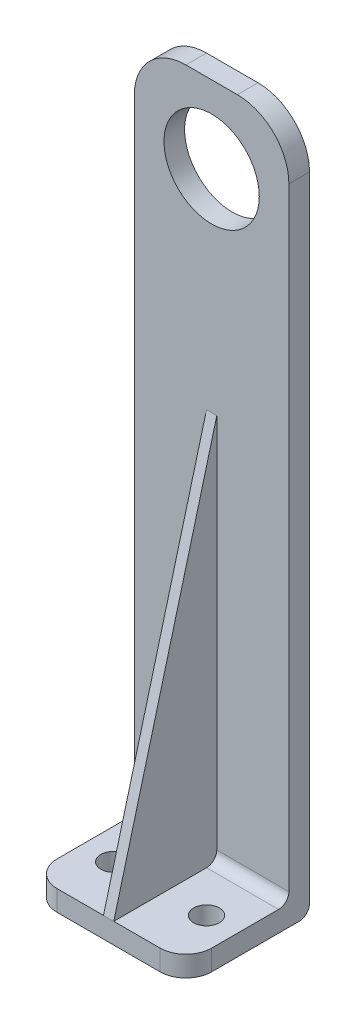
ISO-10303-21;
HEADER;
FILE_DESCRIPTION(('STEP AP214'),'2;1');
FILE_NAME('part.step','',(''),(''),'','','');
FILE_SCHEMA(('AUTOMOTIVE_DESIGN { 1 0 10303 214 1 1 1 1 }'));
ENDSEC;
DATA;
#1=APPLICATION_CONTEXT('core data for automotive mechanical design processes');
#2=APPLICATION_PROTOCOL_DEFINITION('international standard','automotive_design',2000,#1);
#3=PRODUCT_CONTEXT('',#1,'mechanical');
#4=PRODUCT('Part','Part','',(#3));
#5=PRODUCT_RELATED_PRODUCT_CATEGORY('part','',(#4));
#6=PRODUCT_DEFINITION_FORMATION('','',#4);
#7=PRODUCT_DEFINITION_CONTEXT('part definition',#1,'design');
#8=PRODUCT_DEFINITION('design','',#6,#7);
#9=PRODUCT_DEFINITION_SHAPE('','',#8);
#10=(LENGTH_UNIT() NAMED_UNIT(*) SI_UNIT(.MILLI.,.METRE.));
#11=(NAMED_UNIT(*) PLANE_ANGLE_UNIT() SI_UNIT($,.RADIAN.));
#12=(NAMED_UNIT(*) SI_UNIT($,.STERADIAN.) SOLID_ANGLE_UNIT());
#13=UNCERTAINTY_MEASURE_WITH_UNIT(LENGTH_MEASURE(1.E-05),#10,'distance_accuracy_value','');
#14=(GEOMETRIC_REPRESENTATION_CONTEXT(3) GLOBAL_UNCERTAINTY_ASSIGNED_CONTEXT((#13)) GLOBAL_UNIT_ASSIGNED_CONTEXT((#10,
#11,#12)) REPRESENTATION_CONTEXT('',''));
#15=CARTESIAN_POINT('',(0.,0.,0.));
#16=DIRECTION('',(0.,0.,1.));
#17=DIRECTION('',(1.,0.,0.));
#18=AXIS2_PLACEMENT_3D('',#15,#16,#17);
#19=CARTESIAN_POINT('',(0.,-63.5,20.));
#20=DIRECTION('',(0.,1.,0.));
#21=DIRECTION('',(0.,0.,1.));
#22=AXIS2_PLACEMENT_3D('',#19,#20,#21);
#23=PLANE('',#22);
#24=CARTESIAN_POINT('',(-9.,-63.5,10.));
#25=DIRECTION('',(0.,-1.,0.));
#26=DIRECTION('',(1.,0.,0.));
#27=AXIS2_PLACEMENT_3D('',#24,#25,#26);
#28=CIRCLE('',#27,2.5);
#29=CARTESIAN_POINT('',(-6.5,-63.5,10.));
#30=VERTEX_POINT('',#29);
#31=EDGE_CURVE('E185',#30,#30,#28,.T.);
#32=ORIENTED_EDGE('',*,*,#31,.T.);
#33=EDGE_LOOP('',(#32));
#34=FACE_BOUND('',#33,.T.);
#35=DIRECTION('',(0.,0.,-1.));
#36=VECTOR('',#35,1.);
#37=CARTESIAN_POINT('',(-1.,-63.5,20.));
#38=LINE('',#37,#36);
#39=CARTESIAN_POINT('',(-1.,-63.5,20.));
#40=VERTEX_POINT('',#39);
#41=CARTESIAN_POINT('',(-1.,-63.5,2.));
#42=VERTEX_POINT('',#41);
#43=EDGE_CURVE('E155',#40,#42,#38,.T.);
#44=ORIENTED_EDGE('',*,*,#43,.T.);
#45=DIRECTION('',(1.,0.,0.));
#46=VECTOR('',#45,1.);
#47=CARTESIAN_POINT('',(-15.,-63.5,2.));
#48=LINE('',#47,#46);
#49=CARTESIAN_POINT('',(-15.,-63.5,2.));
#50=VERTEX_POINT('',#49);
#51=EDGE_CURVE('E258',#42,#50,#48,.F.);
#52=ORIENTED_EDGE('',*,*,#51,.T.);
#53=DIRECTION('',(0.,0.,-1.));
#54=VECTOR('',#53,1.);
#55=CARTESIAN_POINT('',(-15.,-63.5,20.));
#56=LINE('',#55,#54);
#57=CARTESIAN_POINT('',(-15.,-63.5,15.));
#58=VERTEX_POINT('',#57);
#59=EDGE_CURVE('E223',#58,#50,#56,.T.);
#60=ORIENTED_EDGE('',*,*,#59,.F.);
#61=CARTESIAN_POINT('',(-9.99999999999998,-63.5,15.));
#62=DIRECTION('',(0.,1.,0.));
#63=DIRECTION('',(0.,0.,1.));
#64=AXIS2_PLACEMENT_3D('',#61,#62,#63);
#65=CIRCLE('',#64,5.);
#66=CARTESIAN_POINT('',(-9.99999999999998,-63.5,20.));
#67=VERTEX_POINT('',#66);
#68=EDGE_CURVE('E159',#58,#67,#65,.T.);
#69=ORIENTED_EDGE('',*,*,#68,.T.);
#70=DIRECTION('',(1.,0.,0.));
#71=VECTOR('',#70,1.);
#72=CARTESIAN_POINT('',(0.,-63.5,20.));
#73=LINE('',#72,#71);
#74=EDGE_CURVE('E153',#67,#40,#73,.T.);
#75=ORIENTED_EDGE('',*,*,#74,.T.);
#76=EDGE_LOOP('',(#44,#52,#60,#69,#75));
#77=FACE_BOUND('',#76,.T.);
#78=ADVANCED_FACE('F39',(#34,#77),#23,.T.);
#79=CARTESIAN_POINT('',(9.,-63.5,10.));
#80=DIRECTION('',(0.,-1.,0.));
#81=DIRECTION('',(1.,0.,0.));
#82=AXIS2_PLACEMENT_3D('',#79,#80,#81);
#83=CIRCLE('',#82,2.5);
#84=CARTESIAN_POINT('',(11.5,-63.5,10.));
#85=VERTEX_POINT('',#84);
#86=EDGE_CURVE('E403',#85,#85,#83,.T.);
#87=ORIENTED_EDGE('',*,*,#86,.T.);
#88=EDGE_LOOP('',(#87));
#89=FACE_BOUND('',#88,.T.);
#90=DIRECTION('',(0.,0.,-1.));
#91=VECTOR('',#90,1.);
#92=CARTESIAN_POINT('',(15.,-63.5,20.));
#93=LINE('',#92,#91);
#94=CARTESIAN_POINT('',(15.,-63.5,15.));
#95=VERTEX_POINT('',#94);
#96=CARTESIAN_POINT('',(15.,-63.5,2.));
#97=VERTEX_POINT('',#96);
#98=EDGE_CURVE('E214',#95,#97,#93,.T.);
#99=ORIENTED_EDGE('',*,*,#98,.T.);
#100=DIRECTION('',(1.,0.,0.));
#101=VECTOR('',#100,1.);
#102=CARTESIAN_POINT('',(1.,-63.5,2.));
#103=LINE('',#102,#101);
#104=CARTESIAN_POINT('',(1.,-63.5,2.));
#105=VERTEX_POINT('',#104);
#106=EDGE_CURVE('E253',#97,#105,#103,.F.);
#107=ORIENTED_EDGE('',*,*,#106,.T.);
#108=DIRECTION('',(0.,0.,-1.));
#109=VECTOR('',#108,1.);
#110=CARTESIAN_POINT('',(1.,-63.5,20.));
#111=LINE('',#110,#109);
#112=CARTESIAN_POINT('',(1.,-63.5,20.));
#113=VERTEX_POINT('',#112);
#114=EDGE_CURVE('E175',#113,#105,#111,.T.);
#115=ORIENTED_EDGE('',*,*,#114,.F.);
#116=CARTESIAN_POINT('',(10.,-63.5,20.));
#117=VERTEX_POINT('',#116);
#118=EDGE_CURVE('E165',#113,#117,#73,.T.);
#119=ORIENTED_EDGE('',*,*,#118,.T.);
#120=CARTESIAN_POINT('',(10.,-63.5,15.));
#121=DIRECTION('',(0.,1.,0.));
#122=DIRECTION('',(0.,0.,1.));
#123=AXIS2_PLACEMENT_3D('',#120,#121,#122);
#124=CIRCLE('',#123,5.);
#125=EDGE_CURVE('E242',#117,#95,#124,.T.);
#126=ORIENTED_EDGE('',*,*,#125,.T.);
#127=EDGE_LOOP('',(#99,#107,#115,#119,#126));
#128=FACE_BOUND('',#127,.T.);
#129=ADVANCED_FACE('F323',(#89,#128),#23,.T.);
#130=CARTESIAN_POINT('',(-15.,0.,20.));
#131=DIRECTION('',(1.,0.,0.));
#132=DIRECTION('',(0.,1.,0.));
#133=AXIS2_PLACEMENT_3D('',#130,#131,#132);
#134=PLANE('',#133);
#135=DIRECTION('',(0.,-1.,0.));
#136=VECTOR('',#135,1.);
#137=CARTESIAN_POINT('',(-15.,0.,0.));
#138=LINE('',#137,#136);
#139=CARTESIAN_POINT('',(-15.,57.5,0.));
#140=VERTEX_POINT('',#139);
#141=CARTESIAN_POINT('',(-15.,-61.5,0.));
#142=VERTEX_POINT('',#141);
#143=EDGE_CURVE('E194',#140,#142,#138,.T.);
#144=ORIENTED_EDGE('',*,*,#143,.F.);
#145=DIRECTION('',(0.,0.,1.));
#146=VECTOR('',#145,1.);
#147=CARTESIAN_POINT('',(-15.,57.5,20.));
#148=LINE('',#147,#146);
#149=CARTESIAN_POINT('',(-15.,57.5,-4.));
#150=VERTEX_POINT('',#149);
#151=EDGE_CURVE('E11',#140,#150,#148,.F.);
#152=ORIENTED_EDGE('',*,*,#151,.T.);
#153=DIRECTION('',(0.,-1.,0.));
#154=VECTOR('',#153,1.);
#155=CARTESIAN_POINT('',(-15.,0.,-4.));
#156=LINE('',#155,#154);
#157=CARTESIAN_POINT('',(-15.,-65.5,-4.));
#158=VERTEX_POINT('',#157);
#159=EDGE_CURVE('E202',#150,#158,#156,.T.);
#160=ORIENTED_EDGE('',*,*,#159,.T.);
#161=CARTESIAN_POINT('',(-15.,-65.5,-2.));
#162=DIRECTION('',(1.,0.,0.));
#163=DIRECTION('',(0.,1.,0.));
#164=AXIS2_PLACEMENT_3D('',#161,#162,#163);
#165=CIRCLE('',#164,2.);
#166=CARTESIAN_POINT('',(-15.,-67.5,-2.));
#167=VERTEX_POINT('',#166);
#168=EDGE_CURVE('E269',#158,#167,#165,.F.);
#169=ORIENTED_EDGE('',*,*,#168,.T.);
#170=DIRECTION('',(0.,0.,-1.));
#171=VECTOR('',#170,1.);
#172=CARTESIAN_POINT('',(-15.,-67.5,20.));
#173=LINE('',#172,#171);
#174=CARTESIAN_POINT('',(-15.,-67.5,15.));
#175=VERTEX_POINT('',#174);
#176=EDGE_CURVE('E220',#175,#167,#173,.T.);
#177=ORIENTED_EDGE('',*,*,#176,.F.);
#178=DIRECTION('',(0.,-1.,0.));
#179=VECTOR('',#178,1.);
#180=CARTESIAN_POINT('',(-15.,-63.5,15.));
#181=LINE('',#180,#179);
#182=EDGE_CURVE('E244',#175,#58,#181,.F.);
#183=ORIENTED_EDGE('',*,*,#182,.T.);
#184=ORIENTED_EDGE('',*,*,#59,.T.);
#185=CARTESIAN_POINT('',(-15.,-61.5,2.));
#186=DIRECTION('',(1.,0.,0.));
#187=DIRECTION('',(0.,1.,0.));
#188=AXIS2_PLACEMENT_3D('',#185,#186,#187);
#189=CIRCLE('',#188,2.);
#190=EDGE_CURVE('E273',#50,#142,#189,.T.);
#191=ORIENTED_EDGE('',*,*,#190,.T.);
#192=EDGE_LOOP('',(#144,#152,#160,#169,#177,#183,#184,#191));
#193=FACE_BOUND('',#192,.T.);
#194=ADVANCED_FACE('F307',(#193),#134,.F.);
#195=CARTESIAN_POINT('',(0.,-67.5,20.));
#196=DIRECTION('',(0.,1.,0.));
#197=DIRECTION('',(0.,0.,1.));
#198=AXIS2_PLACEMENT_3D('',#195,#196,#197);
#199=PLANE('',#198);
#200=CARTESIAN_POINT('',(-9.,-67.5,10.));
#201=DIRECTION('',(0.,-1.,0.));
#202=DIRECTION('',(1.,0.,0.));
#203=AXIS2_PLACEMENT_3D('',#200,#201,#202);
#204=CIRCLE('',#203,2.5);
#205=CARTESIAN_POINT('',(-6.5,-67.5,10.));
#206=VERTEX_POINT('',#205);
#207=EDGE_CURVE('E398',#206,#206,#204,.T.);
#208=ORIENTED_EDGE('',*,*,#207,.F.);
#209=EDGE_LOOP('',(#208));
#210=FACE_BOUND('',#209,.T.);
#211=CARTESIAN_POINT('',(9.,-67.5,10.));
#212=DIRECTION('',(0.,-1.,0.));
#213=DIRECTION('',(1.,0.,0.));
#214=AXIS2_PLACEMENT_3D('',#211,#212,#213);
#215=CIRCLE('',#214,2.5);
#216=CARTESIAN_POINT('',(11.5,-67.5,10.));
#217=VERTEX_POINT('',#216);
#218=EDGE_CURVE('E399',#217,#217,#215,.T.);
#219=ORIENTED_EDGE('',*,*,#218,.F.);
#220=EDGE_LOOP('',(#219));
#221=FACE_BOUND('',#220,.T.);
#222=ORIENTED_EDGE('',*,*,#176,.T.);
#223=DIRECTION('',(1.,0.,0.));
#224=VECTOR('',#223,1.);
#225=CARTESIAN_POINT('',(0.,-67.5,-2.));
#226=LINE('',#225,#224);
#227=CARTESIAN_POINT('',(15.,-67.5,-2.));
#228=VERTEX_POINT('',#227);
#229=EDGE_CURVE('E260',#167,#228,#226,.T.);
#230=ORIENTED_EDGE('',*,*,#229,.T.);
#231=DIRECTION('',(0.,0.,-1.));
#232=VECTOR('',#231,1.);
#233=CARTESIAN_POINT('',(15.,-67.5,20.));
#234=LINE('',#233,#232);
#235=CARTESIAN_POINT('',(15.,-67.5,15.));
#236=VERTEX_POINT('',#235);
#237=EDGE_CURVE('E217',#236,#228,#234,.T.);
#238=ORIENTED_EDGE('',*,*,#237,.F.);
#239=CARTESIAN_POINT('',(10.,-67.5,15.));
#240=DIRECTION('',(0.,1.,0.));
#241=DIRECTION('',(0.,0.,1.));
#242=AXIS2_PLACEMENT_3D('',#239,#240,#241);
#243=CIRCLE('',#242,5.);
#244=CARTESIAN_POINT('',(10.,-67.5,20.));
#245=VERTEX_POINT('',#244);
#246=EDGE_CURVE('E236',#236,#245,#243,.F.);
#247=ORIENTED_EDGE('',*,*,#246,.T.);
#248=DIRECTION('',(1.,0.,0.));
#249=VECTOR('',#248,1.);
#250=CARTESIAN_POINT('',(0.,-67.5,20.));
#251=LINE('',#250,#249);
#252=CARTESIAN_POINT('',(-9.99999999999998,-67.5,20.));
#253=VERTEX_POINT('',#252);
#254=EDGE_CURVE('E164',#253,#245,#251,.T.);
#255=ORIENTED_EDGE('',*,*,#254,.F.);
#256=CARTESIAN_POINT('',(-9.99999999999998,-67.5,15.));
#257=DIRECTION('',(0.,1.,0.));
#258=DIRECTION('',(0.,0.,1.));
#259=AXIS2_PLACEMENT_3D('',#256,#257,#258);
#260=CIRCLE('',#259,5.);
#261=EDGE_CURVE('E234',#253,#175,#260,.F.);
#262=ORIENTED_EDGE('',*,*,#261,.T.);
#263=EDGE_LOOP('',(#222,#230,#238,#247,#255,#262));
#264=FACE_BOUND('',#263,.T.);
#265=ADVANCED_FACE('F331',(#210,#221,#264),#199,.F.);
#266=CARTESIAN_POINT('',(15.,0.,20.));
#267=DIRECTION('',(1.,0.,0.));
#268=DIRECTION('',(0.,1.,0.));
#269=AXIS2_PLACEMENT_3D('',#266,#267,#268);
#270=PLANE('',#269);
#271=DIRECTION('',(0.,-1.,0.));
#272=VECTOR('',#271,1.);
#273=CARTESIAN_POINT('',(15.,0.,-4.));
#274=LINE('',#273,#272);
#275=CARTESIAN_POINT('',(15.,57.5,-4.));
#276=VERTEX_POINT('',#275);
#277=CARTESIAN_POINT('',(15.,-65.5,-4.));
#278=VERTEX_POINT('',#277);
#279=EDGE_CURVE('E205',#276,#278,#274,.T.);
#280=ORIENTED_EDGE('',*,*,#279,.F.);
#281=DIRECTION('',(0.,0.,1.));
#282=VECTOR('',#281,1.);
#283=CARTESIAN_POINT('',(15.,57.5,0.));
#284=LINE('',#283,#282);
#285=CARTESIAN_POINT('',(15.,57.5,0.));
#286=VERTEX_POINT('',#285);
#287=EDGE_CURVE('E276',#276,#286,#284,.T.);
#288=ORIENTED_EDGE('',*,*,#287,.T.);
#289=DIRECTION('',(0.,-1.,0.));
#290=VECTOR('',#289,1.);
#291=CARTESIAN_POINT('',(15.,0.,0.));
#292=LINE('',#291,#290);
#293=CARTESIAN_POINT('',(15.,-61.5,0.));
#294=VERTEX_POINT('',#293);
#295=EDGE_CURVE('E210',#286,#294,#292,.T.);
#296=ORIENTED_EDGE('',*,*,#295,.T.);
#297=CARTESIAN_POINT('',(15.,-61.5,2.));
#298=DIRECTION('',(1.,0.,0.));
#299=DIRECTION('',(0.,1.,0.));
#300=AXIS2_PLACEMENT_3D('',#297,#298,#299);
#301=CIRCLE('',#300,2.);
#302=EDGE_CURVE('E271',#294,#97,#301,.F.);
#303=ORIENTED_EDGE('',*,*,#302,.T.);
#304=ORIENTED_EDGE('',*,*,#98,.F.);
#305=DIRECTION('',(0.,-1.,0.));
#306=VECTOR('',#305,1.);
#307=CARTESIAN_POINT('',(15.,0.,15.));
#308=LINE('',#307,#306);
#309=EDGE_CURVE('E231',#95,#236,#308,.T.);
#310=ORIENTED_EDGE('',*,*,#309,.T.);
#311=ORIENTED_EDGE('',*,*,#237,.T.);
#312=CARTESIAN_POINT('',(15.,-65.5,-2.));
#313=DIRECTION('',(1.,0.,0.));
#314=DIRECTION('',(0.,1.,0.));
#315=AXIS2_PLACEMENT_3D('',#312,#313,#314);
#316=CIRCLE('',#315,2.);
#317=EDGE_CURVE('E263',#228,#278,#316,.T.);
#318=ORIENTED_EDGE('',*,*,#317,.T.);
#319=EDGE_LOOP('',(#280,#288,#296,#303,#304,#310,#311,#318));
#320=FACE_BOUND('',#319,.T.);
#321=ADVANCED_FACE('F295',(#320),#270,.T.);
#322=CARTESIAN_POINT('',(0.,0.,20.));
#323=DIRECTION('',(0.,0.,1.));
#324=DIRECTION('',(1.,0.,0.));
#325=AXIS2_PLACEMENT_3D('',#322,#323,#324);
#326=PLANE('',#325);
#327=ORIENTED_EDGE('',*,*,#254,.T.);
#328=DIRECTION('',(0.,-1.,0.));
#329=VECTOR('',#328,1.);
#330=CARTESIAN_POINT('',(9.99999999999999,0.,20.));
#331=LINE('',#330,#329);
#332=EDGE_CURVE('E240',#245,#117,#331,.F.);
#333=ORIENTED_EDGE('',*,*,#332,.T.);
#334=ORIENTED_EDGE('',*,*,#118,.F.);
#335=DIRECTION('',(-1.,0.,0.));
#336=VECTOR('',#335,1.);
#337=CARTESIAN_POINT('',(0.,-63.5,20.));
#338=LINE('',#337,#336);
#339=EDGE_CURVE('E181',#113,#40,#338,.T.);
#340=ORIENTED_EDGE('',*,*,#339,.T.);
#341=ORIENTED_EDGE('',*,*,#74,.F.);
#342=DIRECTION('',(0.,-1.,0.));
#343=VECTOR('',#342,1.);
#344=CARTESIAN_POINT('',(-9.99999999999998,-67.5,20.));
#345=LINE('',#344,#343);
#346=EDGE_CURVE('E238',#67,#253,#345,.T.);
#347=ORIENTED_EDGE('',*,*,#346,.T.);
#348=EDGE_LOOP('',(#327,#333,#334,#340,#341,#347));
#349=FACE_BOUND('',#348,.T.);
#350=ADVANCED_FACE('F189',(#349),#326,.T.);
#351=CARTESIAN_POINT('',(0.,67.5,-4.));
#352=DIRECTION('',(0.,-1.,0.));
#353=DIRECTION('',(1.,0.,0.));
#354=AXIS2_PLACEMENT_3D('',#351,#352,#353);
#355=PLANE('',#354);
#356=DIRECTION('',(1.,0.,0.));
#357=VECTOR('',#356,1.);
#358=CARTESIAN_POINT('',(0.,67.5,0.));
#359=LINE('',#358,#357);
#360=CARTESIAN_POINT('',(-5.,67.5,0.));
#361=VERTEX_POINT('',#360);
#362=CARTESIAN_POINT('',(4.99999999999998,67.5,0.));
#363=VERTEX_POINT('',#362);
#364=EDGE_CURVE('E203',#361,#363,#359,.T.);
#365=ORIENTED_EDGE('',*,*,#364,.T.);
#366=DIRECTION('',(0.,0.,1.));
#367=VECTOR('',#366,1.);
#368=CARTESIAN_POINT('',(4.99999999999998,67.5,-4.));
#369=LINE('',#368,#367);
#370=CARTESIAN_POINT('',(4.99999999999998,67.5,-4.));
#371=VERTEX_POINT('',#370);
#372=EDGE_CURVE('E60',#363,#371,#369,.F.);
#373=ORIENTED_EDGE('',*,*,#372,.T.);
#374=DIRECTION('',(1.,0.,0.));
#375=VECTOR('',#374,1.);
#376=CARTESIAN_POINT('',(0.,67.5,-4.));
#377=LINE('',#376,#375);
#378=CARTESIAN_POINT('',(-5.,67.5,-4.));
#379=VERTEX_POINT('',#378);
#380=EDGE_CURVE('E207',#379,#371,#377,.T.);
#381=ORIENTED_EDGE('',*,*,#380,.F.);
#382=DIRECTION('',(0.,0.,1.));
#383=VECTOR('',#382,1.);
#384=CARTESIAN_POINT('',(-5.,67.5,-4.));
#385=LINE('',#384,#383);
#386=EDGE_CURVE('E283',#379,#361,#385,.T.);
#387=ORIENTED_EDGE('',*,*,#386,.T.);
#388=EDGE_LOOP('',(#365,#373,#381,#387));
#389=FACE_BOUND('',#388,.T.);
#390=ADVANCED_FACE('F303',(#389),#355,.F.);
#391=CARTESIAN_POINT('',(0.,52.5,-4.));
#392=DIRECTION('',(0.,0.,1.));
#393=DIRECTION('',(1.,0.,0.));
#394=AXIS2_PLACEMENT_3D('',#391,#392,#393);
#395=CYLINDRICAL_SURFACE('',#394,9.25);
#396=CARTESIAN_POINT('',(0.,52.5,-4.));
#397=DIRECTION('',(0.,0.,1.));
#398=DIRECTION('',(1.,0.,0.));
#399=AXIS2_PLACEMENT_3D('',#396,#397,#398);
#400=CIRCLE('',#399,9.25);
#401=CARTESIAN_POINT('',(9.25,52.5,-4.));
#402=VERTEX_POINT('',#401);
#403=EDGE_CURVE('E199',#402,#402,#400,.T.);
#404=ORIENTED_EDGE('',*,*,#403,.F.);
#405=EDGE_LOOP('',(#404));
#406=FACE_BOUND('',#405,.T.);
#407=CARTESIAN_POINT('',(0.,52.5,0.));
#408=DIRECTION('',(0.,0.,1.));
#409=DIRECTION('',(1.,0.,0.));
#410=AXIS2_PLACEMENT_3D('',#407,#408,#409);
#411=CIRCLE('',#410,9.25);
#412=CARTESIAN_POINT('',(9.25,52.5,0.));
#413=VERTEX_POINT('',#412);
#414=EDGE_CURVE('E191',#413,#413,#411,.T.);
#415=ORIENTED_EDGE('',*,*,#414,.T.);
#416=EDGE_LOOP('',(#415));
#417=FACE_BOUND('',#416,.T.);
#418=ADVANCED_FACE('F368',(#406,#417),#395,.F.);
#419=CARTESIAN_POINT('',(0.,0.,-4.));
#420=DIRECTION('',(0.,0.,1.));
#421=DIRECTION('',(1.,0.,0.));
#422=AXIS2_PLACEMENT_3D('',#419,#420,#421);
#423=PLANE('',#422);
#424=ORIENTED_EDGE('',*,*,#403,.T.);
#425=EDGE_LOOP('',(#424));
#426=FACE_BOUND('',#425,.T.);
#427=ORIENTED_EDGE('',*,*,#380,.T.);
#428=CARTESIAN_POINT('',(4.99999999999998,57.5,-4.));
#429=DIRECTION('',(0.,0.,1.));
#430=DIRECTION('',(1.,0.,0.));
#431=AXIS2_PLACEMENT_3D('',#428,#429,#430);
#432=CIRCLE('',#431,10.);
#433=EDGE_CURVE('E47',#371,#276,#432,.F.);
#434=ORIENTED_EDGE('',*,*,#433,.T.);
#435=ORIENTED_EDGE('',*,*,#279,.T.);
#436=DIRECTION('',(1.,0.,0.));
#437=VECTOR('',#436,1.);
#438=CARTESIAN_POINT('',(0.,-65.5,-4.));
#439=LINE('',#438,#437);
#440=EDGE_CURVE('E266',#278,#158,#439,.F.);
#441=ORIENTED_EDGE('',*,*,#440,.T.);
#442=ORIENTED_EDGE('',*,*,#159,.F.);
#443=CARTESIAN_POINT('',(-4.99999999999999,57.5,-4.));
#444=DIRECTION('',(0.,0.,1.));
#445=DIRECTION('',(1.,0.,0.));
#446=AXIS2_PLACEMENT_3D('',#443,#444,#445);
#447=CIRCLE('',#446,10.);
#448=EDGE_CURVE('E287',#150,#379,#447,.F.);
#449=ORIENTED_EDGE('',*,*,#448,.T.);
#450=EDGE_LOOP('',(#427,#434,#435,#441,#442,#449));
#451=FACE_BOUND('',#450,.T.);
#452=ADVANCED_FACE('F291',(#426,#451),#423,.F.);
#453=CARTESIAN_POINT('',(0.,0.,0.));
#454=DIRECTION('',(0.,0.,1.));
#455=DIRECTION('',(1.,0.,0.));
#456=AXIS2_PLACEMENT_3D('',#453,#454,#455);
#457=PLANE('',#456);
#458=ORIENTED_EDGE('',*,*,#295,.F.);
#459=CARTESIAN_POINT('',(4.99999999999998,57.5,0.));
#460=DIRECTION('',(0.,0.,1.));
#461=DIRECTION('',(1.,0.,0.));
#462=AXIS2_PLACEMENT_3D('',#459,#460,#461);
#463=CIRCLE('',#462,10.);
#464=EDGE_CURVE('E281',#286,#363,#463,.T.);
#465=ORIENTED_EDGE('',*,*,#464,.T.);
#466=ORIENTED_EDGE('',*,*,#364,.F.);
#467=CARTESIAN_POINT('',(-4.99999999999999,57.5,0.));
#468=DIRECTION('',(0.,0.,1.));
#469=DIRECTION('',(1.,0.,0.));
#470=AXIS2_PLACEMENT_3D('',#467,#468,#469);
#471=CIRCLE('',#470,10.);
#472=EDGE_CURVE('E279',#361,#140,#471,.T.);
#473=ORIENTED_EDGE('',*,*,#472,.T.);
#474=ORIENTED_EDGE('',*,*,#143,.T.);
#475=DIRECTION('',(1.,0.,0.));
#476=VECTOR('',#475,1.);
#477=CARTESIAN_POINT('',(-1.,-61.5,0.));
#478=LINE('',#477,#476);
#479=CARTESIAN_POINT('',(-1.,-61.5,0.));
#480=VERTEX_POINT('',#479);
#481=EDGE_CURVE('E247',#142,#480,#478,.T.);
#482=ORIENTED_EDGE('',*,*,#481,.T.);
#483=DIRECTION('',(0.,1.,0.));
#484=VECTOR('',#483,1.);
#485=CARTESIAN_POINT('',(-1.,0.,0.));
#486=LINE('',#485,#484);
#487=CARTESIAN_POINT('',(-1.,11.4999999999999,0.));
#488=VERTEX_POINT('',#487);
#489=EDGE_CURVE('E226',#480,#488,#486,.T.);
#490=ORIENTED_EDGE('',*,*,#489,.T.);
#491=DIRECTION('',(-1.,0.,0.));
#492=VECTOR('',#491,1.);
#493=CARTESIAN_POINT('',(0.,11.4999999999999,0.));
#494=LINE('',#493,#492);
#495=CARTESIAN_POINT('',(1.,11.4999999999999,0.));
#496=VERTEX_POINT('',#495);
#497=EDGE_CURVE('E184',#496,#488,#494,.T.);
#498=ORIENTED_EDGE('',*,*,#497,.F.);
#499=DIRECTION('',(0.,1.,0.));
#500=VECTOR('',#499,1.);
#501=CARTESIAN_POINT('',(1.,0.,0.));
#502=LINE('',#501,#500);
#503=CARTESIAN_POINT('',(1.,-61.5,0.));
#504=VERTEX_POINT('',#503);
#505=EDGE_CURVE('E229',#504,#496,#502,.T.);
#506=ORIENTED_EDGE('',*,*,#505,.F.);
#507=DIRECTION('',(1.,0.,0.));
#508=VECTOR('',#507,1.);
#509=CARTESIAN_POINT('',(15.,-61.5,0.));
#510=LINE('',#509,#508);
#511=EDGE_CURVE('E250',#504,#294,#510,.T.);
#512=ORIENTED_EDGE('',*,*,#511,.T.);
#513=EDGE_LOOP('',(#458,#465,#466,#473,#474,#482,#490,#498,#506,#512));
#514=FACE_BOUND('',#513,.T.);
#515=ORIENTED_EDGE('',*,*,#414,.F.);
#516=EDGE_LOOP('',(#515));
#517=FACE_BOUND('',#516,.T.);
#518=ADVANCED_FACE('F301',(#514,#517),#457,.T.);
#519=CARTESIAN_POINT('',(0.,11.5,0.));
#520=DIRECTION('',(0.,0.257662650560332,0.966234939601246));
#521=DIRECTION('',(0.,-0.966234939601246,0.257662650560332));
#522=AXIS2_PLACEMENT_3D('',#519,#520,#521);
#523=PLANE('',#522);
#524=ORIENTED_EDGE('',*,*,#339,.F.);
#525=DIRECTION('',(0.,-0.966234939601246,0.257662650560332));
#526=VECTOR('',#525,1.);
#527=CARTESIAN_POINT('',(1.,11.5,0.));
#528=LINE('',#527,#526);
#529=EDGE_CURVE('E176',#496,#113,#528,.T.);
#530=ORIENTED_EDGE('',*,*,#529,.F.);
#531=ORIENTED_EDGE('',*,*,#497,.T.);
#532=DIRECTION('',(0.,-0.966234939601246,0.257662650560332));
#533=VECTOR('',#532,1.);
#534=CARTESIAN_POINT('',(-1.,11.5,0.));
#535=LINE('',#534,#533);
#536=EDGE_CURVE('E172',#488,#40,#535,.T.);
#537=ORIENTED_EDGE('',*,*,#536,.T.);
#538=EDGE_LOOP('',(#524,#530,#531,#537));
#539=FACE_BOUND('',#538,.T.);
#540=ADVANCED_FACE('F179',(#539),#523,.T.);
#541=CARTESIAN_POINT('',(1.,0.,8.));
#542=DIRECTION('',(1.,0.,0.));
#543=DIRECTION('',(0.,0.,-1.));
#544=AXIS2_PLACEMENT_3D('',#541,#542,#543);
#545=PLANE('',#544);
#546=ORIENTED_EDGE('',*,*,#114,.T.);
#547=CARTESIAN_POINT('',(1.,-61.5,2.));
#548=DIRECTION('',(1.,0.,0.));
#549=DIRECTION('',(0.,0.,-1.));
#550=AXIS2_PLACEMENT_3D('',#547,#548,#549);
#551=CIRCLE('',#550,2.);
#552=EDGE_CURVE('E255',#105,#504,#551,.T.);
#553=ORIENTED_EDGE('',*,*,#552,.T.);
#554=ORIENTED_EDGE('',*,*,#505,.T.);
#555=ORIENTED_EDGE('',*,*,#529,.T.);
#556=EDGE_LOOP('',(#546,#553,#554,#555));
#557=FACE_BOUND('',#556,.T.);
#558=ADVANCED_FACE('F381',(#557),#545,.T.);
#559=CARTESIAN_POINT('',(-1.,0.,8.));
#560=DIRECTION('',(1.,0.,0.));
#561=DIRECTION('',(0.,0.,-1.));
#562=AXIS2_PLACEMENT_3D('',#559,#560,#561);
#563=PLANE('',#562);
#564=ORIENTED_EDGE('',*,*,#489,.F.);
#565=CARTESIAN_POINT('',(-1.,-61.5,2.));
#566=DIRECTION('',(1.,0.,0.));
#567=DIRECTION('',(0.,0.,-1.));
#568=AXIS2_PLACEMENT_3D('',#565,#566,#567);
#569=CIRCLE('',#568,2.);
#570=EDGE_CURVE('E174',#480,#42,#569,.F.);
#571=ORIENTED_EDGE('',*,*,#570,.T.);
#572=ORIENTED_EDGE('',*,*,#43,.F.);
#573=ORIENTED_EDGE('',*,*,#536,.F.);
#574=EDGE_LOOP('',(#564,#571,#572,#573));
#575=FACE_BOUND('',#574,.T.);
#576=ADVANCED_FACE('F171',(#575),#563,.F.);
#577=CARTESIAN_POINT('',(9.,-63.5,10.));
#578=DIRECTION('',(0.,-1.,0.));
#579=DIRECTION('',(1.,0.,0.));
#580=AXIS2_PLACEMENT_3D('',#577,#578,#579);
#581=CYLINDRICAL_SURFACE('',#580,2.5);
#582=ORIENTED_EDGE('',*,*,#86,.F.);
#583=EDGE_LOOP('',(#582));
#584=FACE_BOUND('',#583,.T.);
#585=ORIENTED_EDGE('',*,*,#218,.T.);
#586=EDGE_LOOP('',(#585));
#587=FACE_BOUND('',#586,.T.);
#588=ADVANCED_FACE('F384',(#584,#587),#581,.F.);
#589=CARTESIAN_POINT('',(-9.,-63.5,10.));
#590=DIRECTION('',(0.,-1.,0.));
#591=DIRECTION('',(1.,0.,0.));
#592=AXIS2_PLACEMENT_3D('',#589,#590,#591);
#593=CYLINDRICAL_SURFACE('',#592,2.5);
#594=ORIENTED_EDGE('',*,*,#31,.F.);
#595=EDGE_LOOP('',(#594));
#596=FACE_BOUND('',#595,.T.);
#597=ORIENTED_EDGE('',*,*,#207,.T.);
#598=EDGE_LOOP('',(#597));
#599=FACE_BOUND('',#598,.T.);
#600=ADVANCED_FACE('F348',(#596,#599),#593,.F.);
#601=CARTESIAN_POINT('',(9.99999999999999,0.,15.));
#602=DIRECTION('',(0.,-1.,0.));
#603=DIRECTION('',(1.,0.,0.));
#604=AXIS2_PLACEMENT_3D('',#601,#602,#603);
#605=CYLINDRICAL_SURFACE('',#604,5.);
#606=ORIENTED_EDGE('',*,*,#125,.F.);
#607=ORIENTED_EDGE('',*,*,#332,.F.);
#608=ORIENTED_EDGE('',*,*,#246,.F.);
#609=ORIENTED_EDGE('',*,*,#309,.F.);
#610=EDGE_LOOP('',(#606,#607,#608,#609));
#611=FACE_BOUND('',#610,.T.);
#612=ADVANCED_FACE('F328',(#611),#605,.T.);
#613=CARTESIAN_POINT('',(-9.99999999999999,0.,15.));
#614=DIRECTION('',(0.,1.,0.));
#615=DIRECTION('',(-1.,0.,0.));
#616=AXIS2_PLACEMENT_3D('',#613,#614,#615);
#617=CYLINDRICAL_SURFACE('',#616,5.);
#618=ORIENTED_EDGE('',*,*,#68,.F.);
#619=ORIENTED_EDGE('',*,*,#182,.F.);
#620=ORIENTED_EDGE('',*,*,#261,.F.);
#621=ORIENTED_EDGE('',*,*,#346,.F.);
#622=EDGE_LOOP('',(#618,#619,#620,#621));
#623=FACE_BOUND('',#622,.T.);
#624=ADVANCED_FACE('F340',(#623),#617,.T.);
#625=CARTESIAN_POINT('',(0.,-61.5,2.));
#626=DIRECTION('',(-1.,0.,0.));
#627=DIRECTION('',(0.,0.,1.));
#628=AXIS2_PLACEMENT_3D('',#625,#626,#627);
#629=CYLINDRICAL_SURFACE('',#628,2.);
#630=ORIENTED_EDGE('',*,*,#552,.F.);
#631=ORIENTED_EDGE('',*,*,#106,.F.);
#632=ORIENTED_EDGE('',*,*,#302,.F.);
#633=ORIENTED_EDGE('',*,*,#511,.F.);
#634=EDGE_LOOP('',(#630,#631,#632,#633));
#635=FACE_BOUND('',#634,.T.);
#636=ADVANCED_FACE('F318',(#635),#629,.F.);
#637=CARTESIAN_POINT('',(0.,-61.5,2.));
#638=DIRECTION('',(-1.,0.,0.));
#639=DIRECTION('',(0.,0.,1.));
#640=AXIS2_PLACEMENT_3D('',#637,#638,#639);
#641=CYLINDRICAL_SURFACE('',#640,2.);
#642=ORIENTED_EDGE('',*,*,#190,.F.);
#643=ORIENTED_EDGE('',*,*,#51,.F.);
#644=ORIENTED_EDGE('',*,*,#570,.F.);
#645=ORIENTED_EDGE('',*,*,#481,.F.);
#646=EDGE_LOOP('',(#642,#643,#644,#645));
#647=FACE_BOUND('',#646,.T.);
#648=ADVANCED_FACE('F311',(#647),#641,.F.);
#649=CARTESIAN_POINT('',(0.,-65.5,-2.));
#650=DIRECTION('',(1.,0.,0.));
#651=DIRECTION('',(0.,0.,-1.));
#652=AXIS2_PLACEMENT_3D('',#649,#650,#651);
#653=CYLINDRICAL_SURFACE('',#652,2.);
#654=ORIENTED_EDGE('',*,*,#168,.F.);
#655=ORIENTED_EDGE('',*,*,#440,.F.);
#656=ORIENTED_EDGE('',*,*,#317,.F.);
#657=ORIENTED_EDGE('',*,*,#229,.F.);
#658=EDGE_LOOP('',(#654,#655,#656,#657));
#659=FACE_BOUND('',#658,.T.);
#660=ADVANCED_FACE('F337',(#659),#653,.T.);
#661=CARTESIAN_POINT('',(4.99999999999998,57.5,20.));
#662=DIRECTION('',(0.,0.,-1.));
#663=DIRECTION('',(-1.,0.,0.));
#664=AXIS2_PLACEMENT_3D('',#661,#662,#663);
#665=CYLINDRICAL_SURFACE('',#664,10.);
#666=ORIENTED_EDGE('',*,*,#433,.F.);
#667=ORIENTED_EDGE('',*,*,#372,.F.);
#668=ORIENTED_EDGE('',*,*,#464,.F.);
#669=ORIENTED_EDGE('',*,*,#287,.F.);
#670=EDGE_LOOP('',(#666,#667,#668,#669));
#671=FACE_BOUND('',#670,.T.);
#672=ADVANCED_FACE('F298',(#671),#665,.T.);
#673=CARTESIAN_POINT('',(-4.99999999999999,57.5,-4.));
#674=DIRECTION('',(0.,0.,1.));
#675=DIRECTION('',(1.,0.,0.));
#676=AXIS2_PLACEMENT_3D('',#673,#674,#675);
#677=CYLINDRICAL_SURFACE('',#676,10.);
#678=ORIENTED_EDGE('',*,*,#448,.F.);
#679=ORIENTED_EDGE('',*,*,#151,.F.);
#680=ORIENTED_EDGE('',*,*,#472,.F.);
#681=ORIENTED_EDGE('',*,*,#386,.F.);
#682=EDGE_LOOP('',(#678,#679,#680,#681));
#683=FACE_BOUND('',#682,.T.);
#684=ADVANCED_FACE('F41',(#683),#677,.T.);
#685=CLOSED_SHELL('',(#78,#129,#194,#265,#321,#350,#390,#418,#452,#518,#540,#558,#576,#588,#600,
#612,#624,#636,#648,#660,#672,#684));
#686=MANIFOLD_SOLID_BREP('B2',#685);
#687=ADVANCED_BREP_SHAPE_REPRESENTATION('',(#18,#686),#14);
#688=SHAPE_DEFINITION_REPRESENTATION(#9,#687);
ENDSEC;
END-ISO-10303-21;
